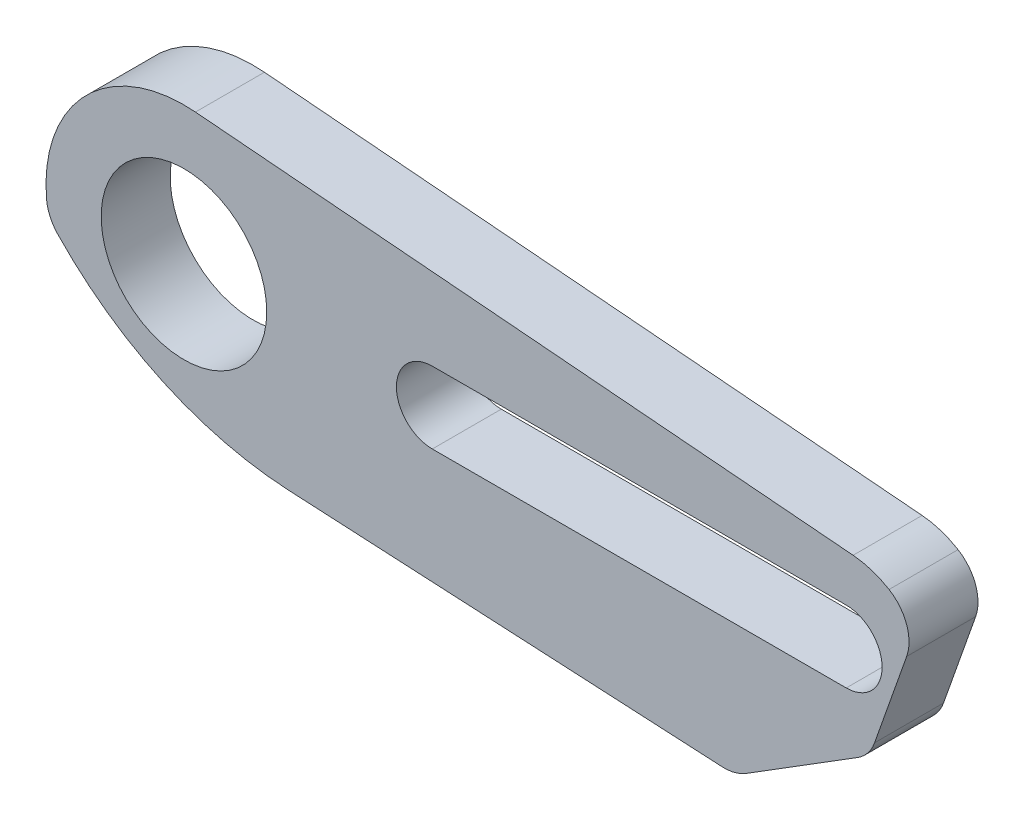
ISO-10303-21;
HEADER;
FILE_DESCRIPTION(('STEP AP214'),'2;1');
FILE_NAME('part.step','',(''),(''),'','','');
FILE_SCHEMA(('AUTOMOTIVE_DESIGN { 1 0 10303 214 1 1 1 1 }'));
ENDSEC;
DATA;
#1=APPLICATION_CONTEXT('core data for automotive mechanical design processes');
#2=APPLICATION_PROTOCOL_DEFINITION('international standard','automotive_design',2000,#1);
#3=PRODUCT_CONTEXT('',#1,'mechanical');
#4=PRODUCT('Part','Part','',(#3));
#5=PRODUCT_RELATED_PRODUCT_CATEGORY('part','',(#4));
#6=PRODUCT_DEFINITION_FORMATION('','',#4);
#7=PRODUCT_DEFINITION_CONTEXT('part definition',#1,'design');
#8=PRODUCT_DEFINITION('design','',#6,#7);
#9=PRODUCT_DEFINITION_SHAPE('','',#8);
#10=(LENGTH_UNIT() NAMED_UNIT(*) SI_UNIT(.MILLI.,.METRE.));
#11=(NAMED_UNIT(*) PLANE_ANGLE_UNIT() SI_UNIT($,.RADIAN.));
#12=(NAMED_UNIT(*) SI_UNIT($,.STERADIAN.) SOLID_ANGLE_UNIT());
#13=UNCERTAINTY_MEASURE_WITH_UNIT(LENGTH_MEASURE(1.E-05),#10,'distance_accuracy_value','');
#14=(GEOMETRIC_REPRESENTATION_CONTEXT(3) GLOBAL_UNCERTAINTY_ASSIGNED_CONTEXT((#13)) GLOBAL_UNIT_ASSIGNED_CONTEXT((#10,
#11,#12)) REPRESENTATION_CONTEXT('',''));
#15=CARTESIAN_POINT('',(0.,0.,0.));
#16=DIRECTION('',(0.,0.,1.));
#17=DIRECTION('',(1.,0.,0.));
#18=AXIS2_PLACEMENT_3D('',#15,#16,#17);
#19=CARTESIAN_POINT('',(0.,0.,2.5));
#20=DIRECTION('',(0.,0.,-1.));
#21=DIRECTION('',(-1.,0.,0.));
#22=AXIS2_PLACEMENT_3D('',#19,#20,#21);
#23=CYLINDRICAL_SURFACE('',#22,5.);
#24=CARTESIAN_POINT('',(0.,0.,0.));
#25=DIRECTION('',(0.,0.,1.));
#26=DIRECTION('',(1.,0.,0.));
#27=AXIS2_PLACEMENT_3D('',#24,#25,#26);
#28=CIRCLE('',#27,5.);
#29=CARTESIAN_POINT('',(0.416666666666667,4.98260864295892,0.));
#30=VERTEX_POINT('',#29);
#31=CARTESIAN_POINT('',(-4.97970425634893,-0.45005057415845,0.));
#32=VERTEX_POINT('',#31);
#33=EDGE_CURVE('E199',#30,#32,#28,.T.);
#34=ORIENTED_EDGE('',*,*,#33,.T.);
#35=DIRECTION('',(0.,0.,-1.));
#36=VECTOR('',#35,1.);
#37=CARTESIAN_POINT('',(-4.97970425634893,-0.45005057415845,2.5));
#38=LINE('',#37,#36);
#39=CARTESIAN_POINT('',(-4.97970425634893,-0.45005057415845,2.5));
#40=VERTEX_POINT('',#39);
#41=EDGE_CURVE('E241',#32,#40,#38,.F.);
#42=ORIENTED_EDGE('',*,*,#41,.T.);
#43=CARTESIAN_POINT('',(0.,0.,2.5));
#44=DIRECTION('',(0.,0.,1.));
#45=DIRECTION('',(1.,0.,0.));
#46=AXIS2_PLACEMENT_3D('',#43,#44,#45);
#47=CIRCLE('',#46,5.);
#48=CARTESIAN_POINT('',(0.416666666666667,4.98260864295892,2.5));
#49=VERTEX_POINT('',#48);
#50=EDGE_CURVE('E167',#49,#40,#47,.T.);
#51=ORIENTED_EDGE('',*,*,#50,.F.);
#52=DIRECTION('',(0.,0.,-1.));
#53=VECTOR('',#52,1.);
#54=CARTESIAN_POINT('',(0.416666666666667,4.98260864295892,2.5));
#55=LINE('',#54,#53);
#56=EDGE_CURVE('E205',#49,#30,#55,.T.);
#57=ORIENTED_EDGE('',*,*,#56,.T.);
#58=EDGE_LOOP('',(#34,#42,#51,#57));
#59=FACE_BOUND('',#58,.T.);
#60=ADVANCED_FACE('F38',(#59),#23,.T.);
#61=CARTESIAN_POINT('',(-0.261321158169134,-4.98630473842068,2.5));
#62=DIRECTION('',(0.0523359562429439,0.998629534754574,0.));
#63=DIRECTION('',(-0.998629534754574,0.0523359562429439,0.));
#64=AXIS2_PLACEMENT_3D('',#61,#62,#63);
#65=PLANE('',#64);
#66=DIRECTION('',(0.998629534754574,-0.0523359562429439,0.));
#67=VECTOR('',#66,1.);
#68=CARTESIAN_POINT('',(-0.261321158169134,-4.98630473842068,0.));
#69=LINE('',#68,#67);
#70=CARTESIAN_POINT('',(3.8142697525012,-5.19989740731507,0.));
#71=VERTEX_POINT('',#70);
#72=CARTESIAN_POINT('',(19.5010735289641,-6.02200795728831,0.));
#73=VERTEX_POINT('',#72);
#74=EDGE_CURVE('E202',#71,#73,#69,.T.);
#75=ORIENTED_EDGE('',*,*,#74,.T.);
#76=DIRECTION('',(0.,0.,-1.));
#77=VECTOR('',#76,1.);
#78=CARTESIAN_POINT('',(19.5010735289641,-6.02200795728831,2.5));
#79=LINE('',#78,#77);
#80=CARTESIAN_POINT('',(19.5010735289641,-6.02200795728831,2.5));
#81=VERTEX_POINT('',#80);
#82=EDGE_CURVE('E165',#73,#81,#79,.F.);
#83=ORIENTED_EDGE('',*,*,#82,.T.);
#84=DIRECTION('',(0.998629534754574,-0.0523359562429439,0.));
#85=VECTOR('',#84,1.);
#86=CARTESIAN_POINT('',(-0.261321158169134,-4.98630473842068,2.5));
#87=LINE('',#86,#85);
#88=CARTESIAN_POINT('',(3.8142697525012,-5.19989740731507,2.5));
#89=VERTEX_POINT('',#88);
#90=EDGE_CURVE('E146',#89,#81,#87,.T.);
#91=ORIENTED_EDGE('',*,*,#90,.F.);
#92=DIRECTION('',(0.,0.,1.));
#93=VECTOR('',#92,1.);
#94=CARTESIAN_POINT('',(3.8142697525012,-5.19989740731507,-17.5));
#95=LINE('',#94,#93);
#96=EDGE_CURVE('E152',#71,#89,#95,.T.);
#97=ORIENTED_EDGE('',*,*,#96,.F.);
#98=EDGE_LOOP('',(#75,#83,#91,#97));
#99=FACE_BOUND('',#98,.T.);
#100=ADVANCED_FACE('F163',(#99),#65,.F.);
#101=CARTESIAN_POINT('',(0.,0.,2.5));
#102=DIRECTION('',(0.,0.,1.));
#103=DIRECTION('',(1.,0.,0.));
#104=AXIS2_PLACEMENT_3D('',#101,#102,#103);
#105=PLANE('',#104);
#106=CARTESIAN_POINT('',(0.,0.,2.5));
#107=DIRECTION('',(0.,0.,1.));
#108=DIRECTION('',(1.,0.,0.));
#109=AXIS2_PLACEMENT_3D('',#106,#107,#108);
#110=CIRCLE('',#109,3.);
#111=CARTESIAN_POINT('',(3.,0.,2.5));
#112=VERTEX_POINT('',#111);
#113=EDGE_CURVE('E204',#112,#112,#110,.T.);
#114=ORIENTED_EDGE('',*,*,#113,.F.);
#115=EDGE_LOOP('',(#114));
#116=FACE_BOUND('',#115,.T.);
#117=CARTESIAN_POINT('',(24.,0.,2.5));
#118=DIRECTION('',(0.,0.,1.));
#119=DIRECTION('',(1.,0.,0.));
#120=AXIS2_PLACEMENT_3D('',#117,#118,#119);
#121=CIRCLE('',#120,1.3);
#122=CARTESIAN_POINT('',(24.,-1.3,2.5));
#123=VERTEX_POINT('',#122);
#124=CARTESIAN_POINT('',(24.,1.3,2.5));
#125=VERTEX_POINT('',#124);
#126=EDGE_CURVE('E270',#123,#125,#121,.T.);
#127=ORIENTED_EDGE('',*,*,#126,.F.);
#128=DIRECTION('',(1.,0.,0.));
#129=VECTOR('',#128,1.);
#130=CARTESIAN_POINT('',(0.,-1.3,2.5));
#131=LINE('',#130,#129);
#132=CARTESIAN_POINT('',(9.,-1.3,2.5));
#133=VERTEX_POINT('',#132);
#134=EDGE_CURVE('E267',#133,#123,#131,.T.);
#135=ORIENTED_EDGE('',*,*,#134,.F.);
#136=CARTESIAN_POINT('',(9.,0.,2.5));
#137=DIRECTION('',(0.,0.,1.));
#138=DIRECTION('',(1.,0.,0.));
#139=AXIS2_PLACEMENT_3D('',#136,#137,#138);
#140=CIRCLE('',#139,1.3);
#141=CARTESIAN_POINT('',(9.,1.3,2.5));
#142=VERTEX_POINT('',#141);
#143=EDGE_CURVE('E264',#142,#133,#140,.T.);
#144=ORIENTED_EDGE('',*,*,#143,.F.);
#145=DIRECTION('',(1.,0.,0.));
#146=VECTOR('',#145,1.);
#147=CARTESIAN_POINT('',(0.,1.3,2.5));
#148=LINE('',#147,#146);
#149=EDGE_CURVE('E262',#142,#125,#148,.T.);
#150=ORIENTED_EDGE('',*,*,#149,.T.);
#151=EDGE_LOOP('',(#127,#135,#144,#150));
#152=FACE_BOUND('',#151,.T.);
#153=ORIENTED_EDGE('',*,*,#90,.T.);
#154=CARTESIAN_POINT('',(19.5795774633285,-4.52406365515645,2.5));
#155=DIRECTION('',(0.,0.,1.));
#156=DIRECTION('',(1.,0.,0.));
#157=AXIS2_PLACEMENT_3D('',#154,#155,#156);
#158=CIRCLE('',#157,1.5);
#159=CARTESIAN_POINT('',(20.3732464243657,-5.79689105126569,2.5));
#160=VERTEX_POINT('',#159);
#161=EDGE_CURVE('E234',#81,#160,#158,.T.);
#162=ORIENTED_EDGE('',*,*,#161,.T.);
#163=DIRECTION('',(0.848551597406159,0.529112640691427,0.));
#164=VECTOR('',#163,1.);
#165=CARTESIAN_POINT('',(8.30638239902121,-13.3211598274145,2.5));
#166=LINE('',#165,#164);
#167=CARTESIAN_POINT('',(24.4059095377878,-3.28233208339141,2.5));
#168=VERTEX_POINT('',#167);
#169=EDGE_CURVE('E258',#160,#168,#166,.T.);
#170=ORIENTED_EDGE('',*,*,#169,.T.);
#171=CARTESIAN_POINT('',(23.6122405767506,-2.00950468728217,2.5));
#172=DIRECTION('',(0.,0.,1.));
#173=DIRECTION('',(1.,0.,0.));
#174=AXIS2_PLACEMENT_3D('',#171,#172,#173);
#175=CIRCLE('',#174,1.5);
#176=CARTESIAN_POINT('',(25.0264541391237,-2.50950468728217,2.5));
#177=VERTEX_POINT('',#176);
#178=EDGE_CURVE('E59',#168,#177,#175,.T.);
#179=ORIENTED_EDGE('',*,*,#178,.T.);
#180=DIRECTION('',(-0.333333333333334,-0.942809041582063,0.));
#181=VECTOR('',#180,1.);
#182=CARTESIAN_POINT('',(24.8514386235981,-3.00452331864623,2.5));
#183=LINE('',#182,#181);
#184=CARTESIAN_POINT('',(26.1906714286505,0.783399073513752,2.5));
#185=VERTEX_POINT('',#184);
#186=EDGE_CURVE('E161',#185,#177,#183,.T.);
#187=ORIENTED_EDGE('',*,*,#186,.F.);
#188=CARTESIAN_POINT('',(24.7764578662774,1.28339907351375,2.5));
#189=DIRECTION('',(0.,0.,1.));
#190=DIRECTION('',(1.,0.,0.));
#191=AXIS2_PLACEMENT_3D('',#188,#189,#190);
#192=CIRCLE('',#191,1.5);
#193=CARTESIAN_POINT('',(25.5529157325548,2.56679814702751,2.5));
#194=VERTEX_POINT('',#193);
#195=EDGE_CURVE('E53',#185,#194,#192,.T.);
#196=ORIENTED_EDGE('',*,*,#195,.T.);
#197=CARTESIAN_POINT('',(24.,0.,2.5));
#198=DIRECTION('',(0.,0.,1.));
#199=DIRECTION('',(1.,0.,0.));
#200=AXIS2_PLACEMENT_3D('',#197,#198,#199);
#201=CIRCLE('',#200,3.);
#202=CARTESIAN_POINT('',(24.25,2.98956518577535,2.5));
#203=VERTEX_POINT('',#202);
#204=EDGE_CURVE('E255',#194,#203,#201,.T.);
#205=ORIENTED_EDGE('',*,*,#204,.T.);
#206=DIRECTION('',(0.996521728591783,-0.0833333333333334,0.));
#207=VECTOR('',#206,1.);
#208=CARTESIAN_POINT('',(0.416666666666667,4.98260864295892,2.5));
#209=LINE('',#208,#207);
#210=EDGE_CURVE('E171',#49,#203,#209,.T.);
#211=ORIENTED_EDGE('',*,*,#210,.F.);
#212=ORIENTED_EDGE('',*,*,#50,.T.);
#213=CARTESIAN_POINT('',(-3.48579297944425,-0.315035401910915,2.5));
#214=DIRECTION('',(0.,0.,1.));
#215=DIRECTION('',(1.,0.,0.));
#216=AXIS2_PLACEMENT_3D('',#213,#214,#215);
#217=CIRCLE('',#216,1.5);
#218=CARTESIAN_POINT('',(-4.57046509557819,-1.35112728996019,2.5));
#219=VERTEX_POINT('',#218);
#220=EDGE_CURVE('E149',#40,#219,#217,.T.);
#221=ORIENTED_EDGE('',*,*,#220,.T.);
#222=CARTESIAN_POINT('',(4.468469205538,7.28297177711711,2.5));
#223=DIRECTION('',(0.,0.,1.));
#224=DIRECTION('',(1.,0.,0.));
#225=AXIS2_PLACEMENT_3D('',#222,#223,#224);
#226=CIRCLE('',#225,12.5);
#227=EDGE_CURVE('E142',#219,#89,#226,.T.);
#228=ORIENTED_EDGE('',*,*,#227,.T.);
#229=EDGE_LOOP('',(#153,#162,#170,#179,#187,#196,#205,#211,#212,#221,#228));
#230=FACE_BOUND('',#229,.T.);
#231=ADVANCED_FACE('F144',(#116,#152,#230),#105,.T.);
#232=CARTESIAN_POINT('',(0.,0.,0.));
#233=DIRECTION('',(0.,0.,1.));
#234=DIRECTION('',(1.,0.,0.));
#235=AXIS2_PLACEMENT_3D('',#232,#233,#234);
#236=PLANE('',#235);
#237=CARTESIAN_POINT('',(24.,0.,0.));
#238=DIRECTION('',(0.,0.,1.));
#239=DIRECTION('',(1.,0.,0.));
#240=AXIS2_PLACEMENT_3D('',#237,#238,#239);
#241=CIRCLE('',#240,1.3);
#242=CARTESIAN_POINT('',(24.,-1.3,0.));
#243=VERTEX_POINT('',#242);
#244=CARTESIAN_POINT('',(24.,1.3,0.));
#245=VERTEX_POINT('',#244);
#246=EDGE_CURVE('E178',#243,#245,#241,.T.);
#247=ORIENTED_EDGE('',*,*,#246,.T.);
#248=DIRECTION('',(1.,0.,0.));
#249=VECTOR('',#248,1.);
#250=CARTESIAN_POINT('',(0.,1.3,0.));
#251=LINE('',#250,#249);
#252=CARTESIAN_POINT('',(9.,1.3,0.));
#253=VERTEX_POINT('',#252);
#254=EDGE_CURVE('E188',#253,#245,#251,.T.);
#255=ORIENTED_EDGE('',*,*,#254,.F.);
#256=CARTESIAN_POINT('',(9.,0.,0.));
#257=DIRECTION('',(0.,0.,1.));
#258=DIRECTION('',(1.,0.,0.));
#259=AXIS2_PLACEMENT_3D('',#256,#257,#258);
#260=CIRCLE('',#259,1.3);
#261=CARTESIAN_POINT('',(9.,-1.3,0.));
#262=VERTEX_POINT('',#261);
#263=EDGE_CURVE('E185',#253,#262,#260,.T.);
#264=ORIENTED_EDGE('',*,*,#263,.T.);
#265=DIRECTION('',(1.,0.,0.));
#266=VECTOR('',#265,1.);
#267=CARTESIAN_POINT('',(0.,-1.3,0.));
#268=LINE('',#267,#266);
#269=EDGE_CURVE('E182',#262,#243,#268,.T.);
#270=ORIENTED_EDGE('',*,*,#269,.T.);
#271=EDGE_LOOP('',(#247,#255,#264,#270));
#272=FACE_BOUND('',#271,.T.);
#273=CARTESIAN_POINT('',(0.,0.,0.));
#274=DIRECTION('',(0.,0.,1.));
#275=DIRECTION('',(1.,0.,0.));
#276=AXIS2_PLACEMENT_3D('',#273,#274,#275);
#277=CIRCLE('',#276,3.);
#278=CARTESIAN_POINT('',(3.,0.,0.));
#279=VERTEX_POINT('',#278);
#280=EDGE_CURVE('E175',#279,#279,#277,.T.);
#281=ORIENTED_EDGE('',*,*,#280,.T.);
#282=EDGE_LOOP('',(#281));
#283=FACE_BOUND('',#282,.T.);
#284=DIRECTION('',(0.848551597406159,0.529112640691427,0.));
#285=VECTOR('',#284,1.);
#286=CARTESIAN_POINT('',(8.30638239902121,-13.3211598274145,0.));
#287=LINE('',#286,#285);
#288=CARTESIAN_POINT('',(20.3732464243657,-5.79689105126569,0.));
#289=VERTEX_POINT('',#288);
#290=CARTESIAN_POINT('',(24.4059095377878,-3.28233208339141,0.));
#291=VERTEX_POINT('',#290);
#292=EDGE_CURVE('E191',#289,#291,#287,.T.);
#293=ORIENTED_EDGE('',*,*,#292,.F.);
#294=CARTESIAN_POINT('',(19.5795774633285,-4.52406365515645,0.));
#295=DIRECTION('',(0.,0.,1.));
#296=DIRECTION('',(1.,0.,0.));
#297=AXIS2_PLACEMENT_3D('',#294,#295,#296);
#298=CIRCLE('',#297,1.5);
#299=EDGE_CURVE('E228',#289,#73,#298,.F.);
#300=ORIENTED_EDGE('',*,*,#299,.T.);
#301=ORIENTED_EDGE('',*,*,#74,.F.);
#302=CARTESIAN_POINT('',(4.468469205538,7.28297177711711,0.));
#303=DIRECTION('',(0.,0.,1.));
#304=DIRECTION('',(1.,0.,0.));
#305=AXIS2_PLACEMENT_3D('',#302,#303,#304);
#306=CIRCLE('',#305,12.5);
#307=CARTESIAN_POINT('',(-4.57046509557819,-1.35112728996019,0.));
#308=VERTEX_POINT('',#307);
#309=EDGE_CURVE('E157',#308,#71,#306,.T.);
#310=ORIENTED_EDGE('',*,*,#309,.F.);
#311=CARTESIAN_POINT('',(-3.48579297944425,-0.315035401910915,0.));
#312=DIRECTION('',(0.,0.,1.));
#313=DIRECTION('',(1.,0.,0.));
#314=AXIS2_PLACEMENT_3D('',#311,#312,#313);
#315=CIRCLE('',#314,1.5);
#316=EDGE_CURVE('E224',#308,#32,#315,.F.);
#317=ORIENTED_EDGE('',*,*,#316,.T.);
#318=ORIENTED_EDGE('',*,*,#33,.F.);
#319=DIRECTION('',(0.996521728591783,-0.0833333333333334,0.));
#320=VECTOR('',#319,1.);
#321=CARTESIAN_POINT('',(0.416666666666667,4.98260864295892,0.));
#322=LINE('',#321,#320);
#323=CARTESIAN_POINT('',(24.25,2.98956518577535,0.));
#324=VERTEX_POINT('',#323);
#325=EDGE_CURVE('E196',#30,#324,#322,.T.);
#326=ORIENTED_EDGE('',*,*,#325,.T.);
#327=CARTESIAN_POINT('',(24.,0.,0.));
#328=DIRECTION('',(0.,0.,1.));
#329=DIRECTION('',(1.,0.,0.));
#330=AXIS2_PLACEMENT_3D('',#327,#328,#329);
#331=CIRCLE('',#330,3.);
#332=CARTESIAN_POINT('',(25.5529157325548,2.56679814702751,0.));
#333=VERTEX_POINT('',#332);
#334=EDGE_CURVE('E194',#333,#324,#331,.T.);
#335=ORIENTED_EDGE('',*,*,#334,.F.);
#336=CARTESIAN_POINT('',(24.7764578662774,1.28339907351375,0.));
#337=DIRECTION('',(0.,0.,1.));
#338=DIRECTION('',(1.,0.,0.));
#339=AXIS2_PLACEMENT_3D('',#336,#337,#338);
#340=CIRCLE('',#339,1.5);
#341=CARTESIAN_POINT('',(26.1906714286505,0.783399073513752,0.));
#342=VERTEX_POINT('',#341);
#343=EDGE_CURVE('E222',#333,#342,#340,.F.);
#344=ORIENTED_EDGE('',*,*,#343,.T.);
#345=DIRECTION('',(-0.333333333333334,-0.942809041582063,0.));
#346=VECTOR('',#345,1.);
#347=CARTESIAN_POINT('',(24.8514386235981,-3.00452331864623,0.));
#348=LINE('',#347,#346);
#349=CARTESIAN_POINT('',(25.0264541391237,-2.50950468728217,0.));
#350=VERTEX_POINT('',#349);
#351=EDGE_CURVE('E179',#342,#350,#348,.T.);
#352=ORIENTED_EDGE('',*,*,#351,.T.);
#353=CARTESIAN_POINT('',(23.6122405767506,-2.00950468728217,0.));
#354=DIRECTION('',(0.,0.,1.));
#355=DIRECTION('',(1.,0.,0.));
#356=AXIS2_PLACEMENT_3D('',#353,#354,#355);
#357=CIRCLE('',#356,1.5);
#358=EDGE_CURVE('E226',#350,#291,#357,.F.);
#359=ORIENTED_EDGE('',*,*,#358,.T.);
#360=EDGE_LOOP('',(#293,#300,#301,#310,#317,#318,#326,#335,#344,#352,#359));
#361=FACE_BOUND('',#360,.T.);
#362=ADVANCED_FACE('F247',(#272,#283,#361),#236,.F.);
#363=CARTESIAN_POINT('',(8.30638239902121,-13.3211598274145,2.5));
#364=DIRECTION('',(-0.529112640691427,0.848551597406159,0.));
#365=DIRECTION('',(-0.848551597406159,-0.529112640691427,0.));
#366=AXIS2_PLACEMENT_3D('',#363,#364,#365);
#367=PLANE('',#366);
#368=ORIENTED_EDGE('',*,*,#169,.F.);
#369=DIRECTION('',(0.,0.,-1.));
#370=VECTOR('',#369,1.);
#371=CARTESIAN_POINT('',(20.3732464243656,-5.79689105126569,2.5));
#372=LINE('',#371,#370);
#373=EDGE_CURVE('E219',#160,#289,#372,.T.);
#374=ORIENTED_EDGE('',*,*,#373,.T.);
#375=ORIENTED_EDGE('',*,*,#292,.T.);
#376=DIRECTION('',(0.,0.,1.));
#377=VECTOR('',#376,1.);
#378=CARTESIAN_POINT('',(24.4059095377878,-3.28233208339141,2.5));
#379=LINE('',#378,#377);
#380=EDGE_CURVE('E216',#291,#168,#379,.T.);
#381=ORIENTED_EDGE('',*,*,#380,.T.);
#382=EDGE_LOOP('',(#368,#374,#375,#381));
#383=FACE_BOUND('',#382,.T.);
#384=ADVANCED_FACE('F289',(#383),#367,.F.);
#385=CARTESIAN_POINT('',(24.,0.,2.5));
#386=DIRECTION('',(0.,0.,-1.));
#387=DIRECTION('',(-1.,0.,0.));
#388=AXIS2_PLACEMENT_3D('',#385,#386,#387);
#389=CYLINDRICAL_SURFACE('',#388,3.);
#390=ORIENTED_EDGE('',*,*,#204,.F.);
#391=DIRECTION('',(0.,0.,-1.));
#392=VECTOR('',#391,1.);
#393=CARTESIAN_POINT('',(25.5529157325548,2.56679814702751,2.5));
#394=LINE('',#393,#392);
#395=EDGE_CURVE('E11',#194,#333,#394,.T.);
#396=ORIENTED_EDGE('',*,*,#395,.T.);
#397=ORIENTED_EDGE('',*,*,#334,.T.);
#398=DIRECTION('',(0.,0.,-1.));
#399=VECTOR('',#398,1.);
#400=CARTESIAN_POINT('',(24.25,2.98956518577535,2.5));
#401=LINE('',#400,#399);
#402=EDGE_CURVE('E207',#203,#324,#401,.T.);
#403=ORIENTED_EDGE('',*,*,#402,.F.);
#404=EDGE_LOOP('',(#390,#396,#397,#403));
#405=FACE_BOUND('',#404,.T.);
#406=ADVANCED_FACE('F315',(#405),#389,.T.);
#407=CARTESIAN_POINT('',(0.416666666666667,4.98260864295892,2.5));
#408=DIRECTION('',(0.0833333333333334,0.996521728591783,0.));
#409=DIRECTION('',(-0.996521728591783,0.0833333333333334,0.));
#410=AXIS2_PLACEMENT_3D('',#407,#408,#409);
#411=PLANE('',#410);
#412=ORIENTED_EDGE('',*,*,#325,.F.);
#413=ORIENTED_EDGE('',*,*,#56,.F.);
#414=ORIENTED_EDGE('',*,*,#210,.T.);
#415=ORIENTED_EDGE('',*,*,#402,.T.);
#416=EDGE_LOOP('',(#412,#413,#414,#415));
#417=FACE_BOUND('',#416,.T.);
#418=ADVANCED_FACE('F311',(#417),#411,.T.);
#419=CARTESIAN_POINT('',(24.,0.,2.5));
#420=DIRECTION('',(0.,0.,-1.));
#421=DIRECTION('',(-1.,0.,0.));
#422=AXIS2_PLACEMENT_3D('',#419,#420,#421);
#423=CYLINDRICAL_SURFACE('',#422,1.3);
#424=ORIENTED_EDGE('',*,*,#246,.F.);
#425=DIRECTION('',(0.,0.,-1.));
#426=VECTOR('',#425,1.);
#427=CARTESIAN_POINT('',(24.,-1.3,2.5));
#428=LINE('',#427,#426);
#429=EDGE_CURVE('E208',#123,#243,#428,.T.);
#430=ORIENTED_EDGE('',*,*,#429,.F.);
#431=ORIENTED_EDGE('',*,*,#126,.T.);
#432=DIRECTION('',(0.,0.,-1.));
#433=VECTOR('',#432,1.);
#434=CARTESIAN_POINT('',(24.,1.3,2.5));
#435=LINE('',#434,#433);
#436=EDGE_CURVE('E166',#125,#245,#435,.T.);
#437=ORIENTED_EDGE('',*,*,#436,.T.);
#438=EDGE_LOOP('',(#424,#430,#431,#437));
#439=FACE_BOUND('',#438,.T.);
#440=ADVANCED_FACE('F314',(#439),#423,.F.);
#441=CARTESIAN_POINT('',(0.,-1.3,2.5));
#442=DIRECTION('',(0.,1.,0.));
#443=DIRECTION('',(0.,0.,1.));
#444=AXIS2_PLACEMENT_3D('',#441,#442,#443);
#445=PLANE('',#444);
#446=ORIENTED_EDGE('',*,*,#269,.F.);
#447=DIRECTION('',(0.,0.,-1.));
#448=VECTOR('',#447,1.);
#449=CARTESIAN_POINT('',(9.,-1.3,2.5));
#450=LINE('',#449,#448);
#451=EDGE_CURVE('E212',#133,#262,#450,.T.);
#452=ORIENTED_EDGE('',*,*,#451,.F.);
#453=ORIENTED_EDGE('',*,*,#134,.T.);
#454=ORIENTED_EDGE('',*,*,#429,.T.);
#455=EDGE_LOOP('',(#446,#452,#453,#454));
#456=FACE_BOUND('',#455,.T.);
#457=ADVANCED_FACE('F329',(#456),#445,.T.);
#458=CARTESIAN_POINT('',(9.,0.,2.5));
#459=DIRECTION('',(0.,0.,-1.));
#460=DIRECTION('',(-1.,0.,0.));
#461=AXIS2_PLACEMENT_3D('',#458,#459,#460);
#462=CYLINDRICAL_SURFACE('',#461,1.3);
#463=ORIENTED_EDGE('',*,*,#263,.F.);
#464=DIRECTION('',(0.,0.,-1.));
#465=VECTOR('',#464,1.);
#466=CARTESIAN_POINT('',(9.,1.3,2.5));
#467=LINE('',#466,#465);
#468=EDGE_CURVE('E169',#142,#253,#467,.T.);
#469=ORIENTED_EDGE('',*,*,#468,.F.);
#470=ORIENTED_EDGE('',*,*,#143,.T.);
#471=ORIENTED_EDGE('',*,*,#451,.T.);
#472=EDGE_LOOP('',(#463,#469,#470,#471));
#473=FACE_BOUND('',#472,.T.);
#474=ADVANCED_FACE('F325',(#473),#462,.F.);
#475=CARTESIAN_POINT('',(0.,1.3,2.5));
#476=DIRECTION('',(0.,1.,0.));
#477=DIRECTION('',(0.,0.,1.));
#478=AXIS2_PLACEMENT_3D('',#475,#476,#477);
#479=PLANE('',#478);
#480=ORIENTED_EDGE('',*,*,#254,.T.);
#481=ORIENTED_EDGE('',*,*,#436,.F.);
#482=ORIENTED_EDGE('',*,*,#149,.F.);
#483=ORIENTED_EDGE('',*,*,#468,.T.);
#484=EDGE_LOOP('',(#480,#481,#482,#483));
#485=FACE_BOUND('',#484,.T.);
#486=ADVANCED_FACE('F321',(#485),#479,.F.);
#487=CARTESIAN_POINT('',(0.,0.,2.5));
#488=DIRECTION('',(0.,0.,-1.));
#489=DIRECTION('',(-1.,0.,0.));
#490=AXIS2_PLACEMENT_3D('',#487,#488,#489);
#491=CYLINDRICAL_SURFACE('',#490,3.);
#492=ORIENTED_EDGE('',*,*,#113,.T.);
#493=EDGE_LOOP('',(#492));
#494=FACE_BOUND('',#493,.T.);
#495=ORIENTED_EDGE('',*,*,#280,.F.);
#496=EDGE_LOOP('',(#495));
#497=FACE_BOUND('',#496,.T.);
#498=ADVANCED_FACE('F324',(#494,#497),#491,.F.);
#499=CARTESIAN_POINT('',(24.8514386235981,-3.00452331864623,0.));
#500=DIRECTION('',(-0.942809041582063,0.333333333333334,0.));
#501=DIRECTION('',(-0.333333333333334,-0.942809041582063,0.));
#502=AXIS2_PLACEMENT_3D('',#499,#500,#501);
#503=PLANE('',#502);
#504=ORIENTED_EDGE('',*,*,#186,.T.);
#505=DIRECTION('',(0.,0.,1.));
#506=VECTOR('',#505,1.);
#507=CARTESIAN_POINT('',(25.0264541391237,-2.50950468728217,0.));
#508=LINE('',#507,#506);
#509=EDGE_CURVE('E239',#177,#350,#508,.F.);
#510=ORIENTED_EDGE('',*,*,#509,.T.);
#511=ORIENTED_EDGE('',*,*,#351,.F.);
#512=DIRECTION('',(0.,0.,-1.));
#513=VECTOR('',#512,1.);
#514=CARTESIAN_POINT('',(26.1906714286505,0.783399073513752,0.));
#515=LINE('',#514,#513);
#516=EDGE_CURVE('E236',#342,#185,#515,.F.);
#517=ORIENTED_EDGE('',*,*,#516,.T.);
#518=EDGE_LOOP('',(#504,#510,#511,#517));
#519=FACE_BOUND('',#518,.T.);
#520=ADVANCED_FACE('F300',(#519),#503,.F.);
#521=CARTESIAN_POINT('',(4.468469205538,7.28297177711711,-17.5));
#522=DIRECTION('',(0.,0.,1.));
#523=DIRECTION('',(1.,0.,0.));
#524=AXIS2_PLACEMENT_3D('',#521,#522,#523);
#525=CYLINDRICAL_SURFACE('',#524,12.5);
#526=ORIENTED_EDGE('',*,*,#227,.F.);
#527=DIRECTION('',(0.,0.,1.));
#528=VECTOR('',#527,1.);
#529=CARTESIAN_POINT('',(-4.57046509557819,-1.35112728996019,-17.5));
#530=LINE('',#529,#528);
#531=EDGE_CURVE('E46',#219,#308,#530,.F.);
#532=ORIENTED_EDGE('',*,*,#531,.T.);
#533=ORIENTED_EDGE('',*,*,#309,.T.);
#534=ORIENTED_EDGE('',*,*,#96,.T.);
#535=EDGE_LOOP('',(#526,#532,#533,#534));
#536=FACE_BOUND('',#535,.T.);
#537=ADVANCED_FACE('F155',(#536),#525,.T.);
#538=CARTESIAN_POINT('',(19.5795774633285,-4.52406365515645,2.5));
#539=DIRECTION('',(0.,0.,-1.));
#540=DIRECTION('',(-1.,0.,0.));
#541=AXIS2_PLACEMENT_3D('',#538,#539,#540);
#542=CYLINDRICAL_SURFACE('',#541,1.5);
#543=ORIENTED_EDGE('',*,*,#161,.F.);
#544=ORIENTED_EDGE('',*,*,#82,.F.);
#545=ORIENTED_EDGE('',*,*,#299,.F.);
#546=ORIENTED_EDGE('',*,*,#373,.F.);
#547=EDGE_LOOP('',(#543,#544,#545,#546));
#548=FACE_BOUND('',#547,.T.);
#549=ADVANCED_FACE('F292',(#548),#542,.T.);
#550=CARTESIAN_POINT('',(23.6122405767506,-2.00950468728217,2.5));
#551=DIRECTION('',(0.,0.,1.));
#552=DIRECTION('',(1.,0.,0.));
#553=AXIS2_PLACEMENT_3D('',#550,#551,#552);
#554=CYLINDRICAL_SURFACE('',#553,1.5);
#555=ORIENTED_EDGE('',*,*,#358,.F.);
#556=ORIENTED_EDGE('',*,*,#509,.F.);
#557=ORIENTED_EDGE('',*,*,#178,.F.);
#558=ORIENTED_EDGE('',*,*,#380,.F.);
#559=EDGE_LOOP('',(#555,#556,#557,#558));
#560=FACE_BOUND('',#559,.T.);
#561=ADVANCED_FACE('F286',(#560),#554,.T.);
#562=CARTESIAN_POINT('',(-3.48579297944425,-0.315035401910915,-17.5));
#563=DIRECTION('',(0.,0.,1.));
#564=DIRECTION('',(1.,0.,0.));
#565=AXIS2_PLACEMENT_3D('',#562,#563,#564);
#566=CYLINDRICAL_SURFACE('',#565,1.5);
#567=ORIENTED_EDGE('',*,*,#316,.F.);
#568=ORIENTED_EDGE('',*,*,#531,.F.);
#569=ORIENTED_EDGE('',*,*,#220,.F.);
#570=ORIENTED_EDGE('',*,*,#41,.F.);
#571=EDGE_LOOP('',(#567,#568,#569,#570));
#572=FACE_BOUND('',#571,.T.);
#573=ADVANCED_FACE('F250',(#572),#566,.T.);
#574=CARTESIAN_POINT('',(24.7764578662774,1.28339907351375,2.5));
#575=DIRECTION('',(0.,0.,-1.));
#576=DIRECTION('',(-1.,0.,0.));
#577=AXIS2_PLACEMENT_3D('',#574,#575,#576);
#578=CYLINDRICAL_SURFACE('',#577,1.5);
#579=ORIENTED_EDGE('',*,*,#343,.F.);
#580=ORIENTED_EDGE('',*,*,#395,.F.);
#581=ORIENTED_EDGE('',*,*,#195,.F.);
#582=ORIENTED_EDGE('',*,*,#516,.F.);
#583=EDGE_LOOP('',(#579,#580,#581,#582));
#584=FACE_BOUND('',#583,.T.);
#585=ADVANCED_FACE('F40',(#584),#578,.T.);
#586=CLOSED_SHELL('',(#60,#100,#231,#362,#384,#406,#418,#440,#457,#474,#486,#498,#520,#537,#549,
#561,#573,#585));
#587=MANIFOLD_SOLID_BREP('B2',#586);
#588=ADVANCED_BREP_SHAPE_REPRESENTATION('',(#18,#587),#14);
#589=SHAPE_DEFINITION_REPRESENTATION(#9,#588);
ENDSEC;
END-ISO-10303-21;
